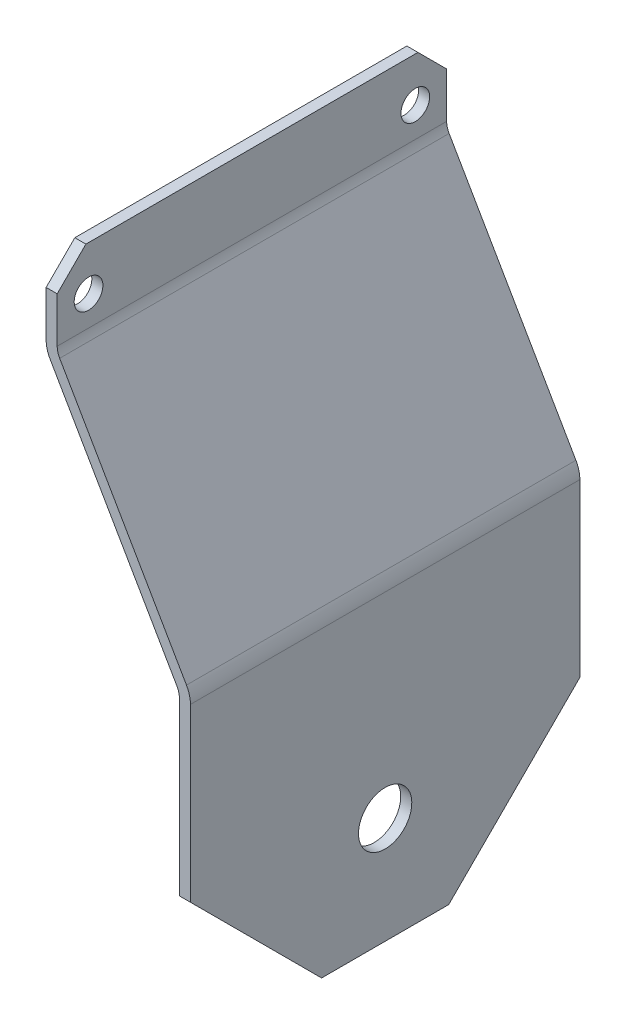
ISO-10303-21;
HEADER;
FILE_DESCRIPTION(('STEP AP214'),'2;1');
FILE_NAME('part.step','',(''),(''),'','','');
FILE_SCHEMA(('AUTOMOTIVE_DESIGN { 1 0 10303 214 1 1 1 1 }'));
ENDSEC;
DATA;
#1=APPLICATION_CONTEXT('core data for automotive mechanical design processes');
#2=APPLICATION_PROTOCOL_DEFINITION('international standard','automotive_design',2000,#1);
#3=PRODUCT_CONTEXT('',#1,'mechanical');
#4=PRODUCT('Part','Part','',(#3));
#5=PRODUCT_RELATED_PRODUCT_CATEGORY('part','',(#4));
#6=PRODUCT_DEFINITION_FORMATION('','',#4);
#7=PRODUCT_DEFINITION_CONTEXT('part definition',#1,'design');
#8=PRODUCT_DEFINITION('design','',#6,#7);
#9=PRODUCT_DEFINITION_SHAPE('','',#8);
#10=(LENGTH_UNIT() NAMED_UNIT(*) SI_UNIT(.MILLI.,.METRE.));
#11=(NAMED_UNIT(*) PLANE_ANGLE_UNIT() SI_UNIT($,.RADIAN.));
#12=(NAMED_UNIT(*) SI_UNIT($,.STERADIAN.) SOLID_ANGLE_UNIT());
#13=UNCERTAINTY_MEASURE_WITH_UNIT(LENGTH_MEASURE(1.E-05),#10,'distance_accuracy_value','');
#14=(GEOMETRIC_REPRESENTATION_CONTEXT(3) GLOBAL_UNCERTAINTY_ASSIGNED_CONTEXT((#13)) GLOBAL_UNIT_ASSIGNED_CONTEXT((#10,
#11,#12)) REPRESENTATION_CONTEXT('',''));
#15=CARTESIAN_POINT('',(0.,0.,0.));
#16=DIRECTION('',(0.,0.,1.));
#17=DIRECTION('',(1.,0.,0.));
#18=AXIS2_PLACEMENT_3D('',#15,#16,#17);
#19=CARTESIAN_POINT('',(-32.5,76.2916512459885,-47.5));
#20=DIRECTION('',(0.,1.,0.));
#21=DIRECTION('',(0.,0.,1.));
#22=AXIS2_PLACEMENT_3D('',#19,#20,#21);
#23=PLANE('',#22);
#24=DIRECTION('',(1.,0.,0.));
#25=VECTOR('',#24,1.);
#26=CARTESIAN_POINT('',(-20.9172517799081,76.2916512459885,-40.5));
#27=LINE('',#26,#25);
#28=CARTESIAN_POINT('',(-32.5,76.2916512459885,-40.5));
#29=VERTEX_POINT('',#28);
#30=CARTESIAN_POINT('',(-29.8,76.2916512459885,-40.5));
#31=VERTEX_POINT('',#30);
#32=EDGE_CURVE('E224',#29,#31,#27,.T.);
#33=ORIENTED_EDGE('',*,*,#32,.F.);
#34=DIRECTION('',(0.,0.,1.));
#35=VECTOR('',#34,1.);
#36=CARTESIAN_POINT('',(-32.5,76.2916512459885,-47.5));
#37=LINE('',#36,#35);
#38=CARTESIAN_POINT('',(-32.5,76.2916512459885,40.5));
#39=VERTEX_POINT('',#38);
#40=EDGE_CURVE('E154',#39,#29,#37,.F.);
#41=ORIENTED_EDGE('',*,*,#40,.F.);
#42=DIRECTION('',(1.,0.,0.));
#43=VECTOR('',#42,1.);
#44=CARTESIAN_POINT('',(-20.9172517799081,76.2916512459885,40.5));
#45=LINE('',#44,#43);
#46=CARTESIAN_POINT('',(-29.8,76.2916512459885,40.5));
#47=VERTEX_POINT('',#46);
#48=EDGE_CURVE('E152',#47,#39,#45,.F.);
#49=ORIENTED_EDGE('',*,*,#48,.F.);
#50=DIRECTION('',(0.,0.,-1.));
#51=VECTOR('',#50,1.);
#52=CARTESIAN_POINT('',(-29.8,76.2916512459885,-47.5));
#53=LINE('',#52,#51);
#54=EDGE_CURVE('E140',#31,#47,#53,.F.);
#55=ORIENTED_EDGE('',*,*,#54,.F.);
#56=EDGE_LOOP('',(#33,#41,#49,#55));
#57=FACE_BOUND('',#56,.T.);
#58=ADVANCED_FACE('F17',(#57),#23,.T.);
#59=CARTESIAN_POINT('',(-32.5,65.4996512459885,39.853));
#60=DIRECTION('',(1.,0.,0.));
#61=DIRECTION('',(0.,0.,-1.));
#62=AXIS2_PLACEMENT_3D('',#59,#60,#61);
#63=CYLINDRICAL_SURFACE('',#62,3.49999999999999);
#64=CARTESIAN_POINT('',(-29.8,65.4996512459885,39.853));
#65=DIRECTION('',(1.,0.,0.));
#66=DIRECTION('',(0.,0.,-1.));
#67=AXIS2_PLACEMENT_3D('',#64,#65,#66);
#68=CIRCLE('',#67,3.49999999999999);
#69=CARTESIAN_POINT('',(-29.8,65.4996512459885,36.353));
#70=VERTEX_POINT('',#69);
#71=EDGE_CURVE('E149',#70,#70,#68,.F.);
#72=ORIENTED_EDGE('',*,*,#71,.F.);
#73=EDGE_LOOP('',(#72));
#74=FACE_BOUND('',#73,.T.);
#75=CARTESIAN_POINT('',(-32.5,65.4996512459885,39.853));
#76=DIRECTION('',(1.,0.,0.));
#77=DIRECTION('',(0.,0.,-1.));
#78=AXIS2_PLACEMENT_3D('',#75,#76,#77);
#79=CIRCLE('',#78,3.49999999999999);
#80=CARTESIAN_POINT('',(-32.5,65.4996512459885,36.353));
#81=VERTEX_POINT('',#80);
#82=EDGE_CURVE('E197',#81,#81,#79,.T.);
#83=ORIENTED_EDGE('',*,*,#82,.F.);
#84=EDGE_LOOP('',(#83));
#85=FACE_BOUND('',#84,.T.);
#86=ADVANCED_FACE('F276',(#74,#85),#63,.F.);
#87=CARTESIAN_POINT('',(-32.5,65.4996512459885,-39.853));
#88=DIRECTION('',(1.,0.,0.));
#89=DIRECTION('',(0.,0.,-1.));
#90=AXIS2_PLACEMENT_3D('',#87,#88,#89);
#91=CYLINDRICAL_SURFACE('',#90,3.5);
#92=CARTESIAN_POINT('',(-29.8,65.4996512459885,-39.853));
#93=DIRECTION('',(1.,0.,0.));
#94=DIRECTION('',(0.,0.,-1.));
#95=AXIS2_PLACEMENT_3D('',#92,#93,#94);
#96=CIRCLE('',#95,3.5);
#97=CARTESIAN_POINT('',(-29.8,65.4996512459885,-43.353));
#98=VERTEX_POINT('',#97);
#99=EDGE_CURVE('E160',#98,#98,#96,.F.);
#100=ORIENTED_EDGE('',*,*,#99,.F.);
#101=EDGE_LOOP('',(#100));
#102=FACE_BOUND('',#101,.T.);
#103=CARTESIAN_POINT('',(-32.5,65.4996512459885,-39.853));
#104=DIRECTION('',(1.,0.,0.));
#105=DIRECTION('',(0.,0.,-1.));
#106=AXIS2_PLACEMENT_3D('',#103,#104,#105);
#107=CIRCLE('',#106,3.5);
#108=CARTESIAN_POINT('',(-32.5,65.4996512459885,-43.353));
#109=VERTEX_POINT('',#108);
#110=EDGE_CURVE('E268',#109,#109,#107,.T.);
#111=ORIENTED_EDGE('',*,*,#110,.F.);
#112=EDGE_LOOP('',(#111));
#113=FACE_BOUND('',#112,.T.);
#114=ADVANCED_FACE('F279',(#102,#113),#91,.F.);
#115=CARTESIAN_POINT('',(2.70000000000001,-75.,-47.5));
#116=DIRECTION('',(0.,-1.,0.));
#117=DIRECTION('',(0.,0.,-1.));
#118=AXIS2_PLACEMENT_3D('',#115,#116,#117);
#119=PLANE('',#118);
#120=DIRECTION('',(1.,0.,0.));
#121=VECTOR('',#120,1.);
#122=CARTESIAN_POINT('',(-3.31725177990806,-75.,15.5));
#123=LINE('',#122,#121);
#124=CARTESIAN_POINT('',(0.,-75.,15.5));
#125=VERTEX_POINT('',#124);
#126=CARTESIAN_POINT('',(2.7,-75.,15.5));
#127=VERTEX_POINT('',#126);
#128=EDGE_CURVE('E211',#125,#127,#123,.T.);
#129=ORIENTED_EDGE('',*,*,#128,.F.);
#130=DIRECTION('',(0.,0.,1.));
#131=VECTOR('',#130,1.);
#132=CARTESIAN_POINT('',(0.,-75.,-47.5));
#133=LINE('',#132,#131);
#134=CARTESIAN_POINT('',(0.,-75.,-15.5));
#135=VERTEX_POINT('',#134);
#136=EDGE_CURVE('E186',#135,#125,#133,.T.);
#137=ORIENTED_EDGE('',*,*,#136,.F.);
#138=DIRECTION('',(1.,0.,0.));
#139=VECTOR('',#138,1.);
#140=CARTESIAN_POINT('',(-3.31725177990806,-75.,-15.5));
#141=LINE('',#140,#139);
#142=CARTESIAN_POINT('',(2.7,-75.,-15.5));
#143=VERTEX_POINT('',#142);
#144=EDGE_CURVE('E215',#143,#135,#141,.F.);
#145=ORIENTED_EDGE('',*,*,#144,.F.);
#146=DIRECTION('',(0.,0.,-1.));
#147=VECTOR('',#146,1.);
#148=CARTESIAN_POINT('',(2.7,-75.,-47.5));
#149=LINE('',#148,#147);
#150=EDGE_CURVE('E180',#127,#143,#149,.T.);
#151=ORIENTED_EDGE('',*,*,#150,.F.);
#152=EDGE_LOOP('',(#129,#137,#145,#151));
#153=FACE_BOUND('',#152,.T.);
#154=ADVANCED_FACE('F400',(#153),#119,.T.);
#155=CARTESIAN_POINT('',(2.7,-49.,0.));
#156=DIRECTION('',(-1.,0.,0.));
#157=DIRECTION('',(0.,-1.,0.));
#158=AXIS2_PLACEMENT_3D('',#155,#156,#157);
#159=CYLINDRICAL_SURFACE('',#158,6.5);
#160=CARTESIAN_POINT('',(0.,-49.,0.));
#161=DIRECTION('',(-1.,0.,0.));
#162=DIRECTION('',(0.,-1.,0.));
#163=AXIS2_PLACEMENT_3D('',#160,#161,#162);
#164=CIRCLE('',#163,6.5);
#165=CARTESIAN_POINT('',(0.,-55.5,0.));
#166=VERTEX_POINT('',#165);
#167=EDGE_CURVE('E176',#166,#166,#164,.F.);
#168=ORIENTED_EDGE('',*,*,#167,.F.);
#169=EDGE_LOOP('',(#168));
#170=FACE_BOUND('',#169,.T.);
#171=CARTESIAN_POINT('',(2.7,-49.,0.));
#172=DIRECTION('',(-1.,0.,0.));
#173=DIRECTION('',(0.,-1.,0.));
#174=AXIS2_PLACEMENT_3D('',#171,#172,#173);
#175=CIRCLE('',#174,6.5);
#176=CARTESIAN_POINT('',(2.7,-55.5,0.));
#177=VERTEX_POINT('',#176);
#178=EDGE_CURVE('E21',#177,#177,#175,.T.);
#179=ORIENTED_EDGE('',*,*,#178,.F.);
#180=EDGE_LOOP('',(#179));
#181=FACE_BOUND('',#180,.T.);
#182=ADVANCED_FACE('F19',(#170,#181),#159,.F.);
#183=CARTESIAN_POINT('',(-20.9172517799081,72.7916512459885,-44.));
#184=DIRECTION('',(0.,0.707106781186548,-0.707106781186548));
#185=DIRECTION('',(0.,0.707106781186548,0.707106781186548));
#186=AXIS2_PLACEMENT_3D('',#183,#184,#185);
#187=PLANE('',#186);
#188=DIRECTION('',(0.,0.707106781186548,0.707106781186547));
#189=VECTOR('',#188,1.);
#190=CARTESIAN_POINT('',(-29.8,69.2916512459885,-47.5));
#191=LINE('',#190,#189);
#192=CARTESIAN_POINT('',(-29.8,69.2916512459885,-47.5));
#193=VERTEX_POINT('',#192);
#194=EDGE_CURVE('E147',#193,#31,#191,.T.);
#195=ORIENTED_EDGE('',*,*,#194,.F.);
#196=DIRECTION('',(1.,0.,0.));
#197=VECTOR('',#196,1.);
#198=CARTESIAN_POINT('',(-9.33450355981613,69.2916512459885,-47.5));
#199=LINE('',#198,#197);
#200=CARTESIAN_POINT('',(-32.5,69.2916512459885,-47.5));
#201=VERTEX_POINT('',#200);
#202=EDGE_CURVE('E200',#193,#201,#199,.F.);
#203=ORIENTED_EDGE('',*,*,#202,.T.);
#204=DIRECTION('',(0.,-0.707106781186548,-0.707106781186547));
#205=VECTOR('',#204,1.);
#206=CARTESIAN_POINT('',(-32.5,76.2916512459885,-40.5));
#207=LINE('',#206,#205);
#208=EDGE_CURVE('E194',#29,#201,#207,.T.);
#209=ORIENTED_EDGE('',*,*,#208,.F.);
#210=ORIENTED_EDGE('',*,*,#32,.T.);
#211=EDGE_LOOP('',(#195,#203,#209,#210));
#212=FACE_BOUND('',#211,.T.);
#213=ADVANCED_FACE('F416',(#212),#187,.T.);
#214=CARTESIAN_POINT('',(-3.31725177990806,-59.,-31.5));
#215=DIRECTION('',(0.,-0.707106781186548,-0.707106781186548));
#216=DIRECTION('',(0.,0.707106781186548,-0.707106781186548));
#217=AXIS2_PLACEMENT_3D('',#214,#215,#216);
#218=PLANE('',#217);
#219=DIRECTION('',(0.,-0.707106781186548,0.707106781186548));
#220=VECTOR('',#219,1.);
#221=CARTESIAN_POINT('',(0.,-43.,-47.5));
#222=LINE('',#221,#220);
#223=CARTESIAN_POINT('',(0.,-43.,-47.5));
#224=VERTEX_POINT('',#223);
#225=EDGE_CURVE('E183',#224,#135,#222,.T.);
#226=ORIENTED_EDGE('',*,*,#225,.F.);
#227=DIRECTION('',(1.,0.,0.));
#228=VECTOR('',#227,1.);
#229=CARTESIAN_POINT('',(-9.33450355981613,-43.,-47.5));
#230=LINE('',#229,#228);
#231=CARTESIAN_POINT('',(2.7,-43.,-47.5));
#232=VERTEX_POINT('',#231);
#233=EDGE_CURVE('E173',#224,#232,#230,.T.);
#234=ORIENTED_EDGE('',*,*,#233,.T.);
#235=DIRECTION('',(0.,0.707106781186548,-0.707106781186548));
#236=VECTOR('',#235,1.);
#237=CARTESIAN_POINT('',(2.7,-75.,-15.5));
#238=LINE('',#237,#236);
#239=EDGE_CURVE('E87',#143,#232,#238,.T.);
#240=ORIENTED_EDGE('',*,*,#239,.F.);
#241=ORIENTED_EDGE('',*,*,#144,.T.);
#242=EDGE_LOOP('',(#226,#234,#240,#241));
#243=FACE_BOUND('',#242,.T.);
#244=ADVANCED_FACE('F396',(#243),#218,.T.);
#245=CARTESIAN_POINT('',(-3.31725177990806,-59.,31.5));
#246=DIRECTION('',(0.,-0.707106781186548,0.707106781186548));
#247=DIRECTION('',(0.,-0.707106781186548,-0.707106781186548));
#248=AXIS2_PLACEMENT_3D('',#245,#246,#247);
#249=PLANE('',#248);
#250=DIRECTION('',(0.,-0.707106781186548,-0.707106781186548));
#251=VECTOR('',#250,1.);
#252=CARTESIAN_POINT('',(2.7,-43.,47.5));
#253=LINE('',#252,#251);
#254=CARTESIAN_POINT('',(2.7,-43.,47.5));
#255=VERTEX_POINT('',#254);
#256=EDGE_CURVE('E177',#255,#127,#253,.T.);
#257=ORIENTED_EDGE('',*,*,#256,.F.);
#258=DIRECTION('',(1.,0.,0.));
#259=VECTOR('',#258,1.);
#260=CARTESIAN_POINT('',(-9.33450355981613,-43.,47.5));
#261=LINE('',#260,#259);
#262=CARTESIAN_POINT('',(0.,-43.,47.5));
#263=VERTEX_POINT('',#262);
#264=EDGE_CURVE('E256',#263,#255,#261,.T.);
#265=ORIENTED_EDGE('',*,*,#264,.F.);
#266=DIRECTION('',(0.,0.707106781186548,0.707106781186548));
#267=VECTOR('',#266,1.);
#268=CARTESIAN_POINT('',(0.,-75.,15.5));
#269=LINE('',#268,#267);
#270=EDGE_CURVE('E220',#125,#263,#269,.T.);
#271=ORIENTED_EDGE('',*,*,#270,.F.);
#272=ORIENTED_EDGE('',*,*,#128,.T.);
#273=EDGE_LOOP('',(#257,#265,#271,#272));
#274=FACE_BOUND('',#273,.T.);
#275=ADVANCED_FACE('F422',(#274),#249,.T.);
#276=CARTESIAN_POINT('',(2.7,0.723462819564035,-47.5));
#277=DIRECTION('',(1.,0.,0.));
#278=DIRECTION('',(0.,0.,-1.));
#279=AXIS2_PLACEMENT_3D('',#276,#277,#278);
#280=PLANE('',#279);
#281=ORIENTED_EDGE('',*,*,#178,.T.);
#282=EDGE_LOOP('',(#281));
#283=FACE_BOUND('',#282,.T.);
#284=ORIENTED_EDGE('',*,*,#256,.T.);
#285=ORIENTED_EDGE('',*,*,#150,.T.);
#286=ORIENTED_EDGE('',*,*,#239,.T.);
#287=DIRECTION('',(0.,1.,0.));
#288=VECTOR('',#287,1.);
#289=CARTESIAN_POINT('',(2.7,2.13709589961981,-47.5));
#290=LINE('',#289,#288);
#291=CARTESIAN_POINT('',(2.7,-1.20577136594005,-47.5));
#292=VERTEX_POINT('',#291);
#293=EDGE_CURVE('E79',#232,#292,#290,.T.);
#294=ORIENTED_EDGE('',*,*,#293,.T.);
#295=DIRECTION('',(0.,0.,-1.));
#296=VECTOR('',#295,1.);
#297=CARTESIAN_POINT('',(2.7,-1.20577136594005,0.));
#298=LINE('',#297,#296);
#299=CARTESIAN_POINT('',(2.7,-1.20577136594005,47.5));
#300=VERTEX_POINT('',#299);
#301=EDGE_CURVE('E174',#300,#292,#298,.T.);
#302=ORIENTED_EDGE('',*,*,#301,.F.);
#303=DIRECTION('',(0.,1.,0.));
#304=VECTOR('',#303,1.);
#305=CARTESIAN_POINT('',(2.7,2.13709589961981,47.5));
#306=LINE('',#305,#304);
#307=EDGE_CURVE('E254',#255,#300,#306,.T.);
#308=ORIENTED_EDGE('',*,*,#307,.F.);
#309=EDGE_LOOP('',(#284,#285,#286,#294,#302,#308));
#310=FACE_BOUND('',#309,.T.);
#311=ADVANCED_FACE('F420',(#283,#310),#280,.T.);
#312=CARTESIAN_POINT('',(-29.8,76.2916512459885,-47.5));
#313=DIRECTION('',(1.,0.,0.));
#314=DIRECTION('',(0.,0.,-1.));
#315=AXIS2_PLACEMENT_3D('',#312,#313,#314);
#316=PLANE('',#315);
#317=ORIENTED_EDGE('',*,*,#99,.T.);
#318=EDGE_LOOP('',(#317));
#319=FACE_BOUND('',#318,.T.);
#320=ORIENTED_EDGE('',*,*,#71,.T.);
#321=EDGE_LOOP('',(#320));
#322=FACE_BOUND('',#321,.T.);
#323=ORIENTED_EDGE('',*,*,#194,.T.);
#324=ORIENTED_EDGE('',*,*,#54,.T.);
#325=DIRECTION('',(0.,-0.707106781186548,0.707106781186547));
#326=VECTOR('',#325,1.);
#327=CARTESIAN_POINT('',(-29.8,72.7916512459885,44.));
#328=LINE('',#327,#326);
#329=CARTESIAN_POINT('',(-29.8,69.2916512459885,47.5));
#330=VERTEX_POINT('',#329);
#331=EDGE_CURVE('E145',#330,#47,#328,.F.);
#332=ORIENTED_EDGE('',*,*,#331,.F.);
#333=DIRECTION('',(0.,1.,0.));
#334=VECTOR('',#333,1.);
#335=CARTESIAN_POINT('',(-29.8,2.13709589961981,47.5));
#336=LINE('',#335,#334);
#337=CARTESIAN_POINT('',(-29.8,58.2208854314926,47.5));
#338=VERTEX_POINT('',#337);
#339=EDGE_CURVE('E250',#338,#330,#336,.T.);
#340=ORIENTED_EDGE('',*,*,#339,.F.);
#341=DIRECTION('',(0.,0.,1.));
#342=VECTOR('',#341,1.);
#343=CARTESIAN_POINT('',(-29.8,58.2208854314926,0.));
#344=LINE('',#343,#342);
#345=CARTESIAN_POINT('',(-29.8,58.2208854314926,-47.5));
#346=VERTEX_POINT('',#345);
#347=EDGE_CURVE('E170',#338,#346,#344,.F.);
#348=ORIENTED_EDGE('',*,*,#347,.T.);
#349=DIRECTION('',(0.,1.,0.));
#350=VECTOR('',#349,1.);
#351=CARTESIAN_POINT('',(-29.8,2.13709589961981,-47.5));
#352=LINE('',#351,#350);
#353=EDGE_CURVE('E204',#346,#193,#352,.T.);
#354=ORIENTED_EDGE('',*,*,#353,.T.);
#355=EDGE_LOOP('',(#323,#324,#332,#340,#348,#354));
#356=FACE_BOUND('',#355,.T.);
#357=ADVANCED_FACE('F142',(#319,#322,#356),#316,.T.);
#358=CARTESIAN_POINT('',(-20.9172517799081,72.7916512459885,44.));
#359=DIRECTION('',(0.,0.707106781186547,0.707106781186548));
#360=DIRECTION('',(0.,-0.707106781186548,0.707106781186547));
#361=AXIS2_PLACEMENT_3D('',#358,#359,#360);
#362=PLANE('',#361);
#363=DIRECTION('',(0.,0.707106781186548,-0.707106781186547));
#364=VECTOR('',#363,1.);
#365=CARTESIAN_POINT('',(-32.5,69.2916512459885,47.5));
#366=LINE('',#365,#364);
#367=CARTESIAN_POINT('',(-32.5,69.2916512459885,47.5));
#368=VERTEX_POINT('',#367);
#369=EDGE_CURVE('E129',#368,#39,#366,.T.);
#370=ORIENTED_EDGE('',*,*,#369,.F.);
#371=DIRECTION('',(1.,0.,0.));
#372=VECTOR('',#371,1.);
#373=CARTESIAN_POINT('',(-9.33450355981613,69.2916512459885,47.5));
#374=LINE('',#373,#372);
#375=EDGE_CURVE('E158',#330,#368,#374,.F.);
#376=ORIENTED_EDGE('',*,*,#375,.F.);
#377=ORIENTED_EDGE('',*,*,#331,.T.);
#378=ORIENTED_EDGE('',*,*,#48,.T.);
#379=EDGE_LOOP('',(#370,#376,#377,#378));
#380=FACE_BOUND('',#379,.T.);
#381=ADVANCED_FACE('F156',(#380),#362,.T.);
#382=CARTESIAN_POINT('',(-32.5,56.2916512459885,-47.5));
#383=DIRECTION('',(-1.,0.,0.));
#384=DIRECTION('',(0.,0.,1.));
#385=AXIS2_PLACEMENT_3D('',#382,#383,#384);
#386=PLANE('',#385);
#387=ORIENTED_EDGE('',*,*,#110,.T.);
#388=EDGE_LOOP('',(#387));
#389=FACE_BOUND('',#388,.T.);
#390=ORIENTED_EDGE('',*,*,#82,.T.);
#391=EDGE_LOOP('',(#390));
#392=FACE_BOUND('',#391,.T.);
#393=DIRECTION('',(0.,0.,1.));
#394=VECTOR('',#393,1.);
#395=CARTESIAN_POINT('',(-32.5,58.2208854314926,0.));
#396=LINE('',#395,#394);
#397=CARTESIAN_POINT('',(-32.5,58.2208854314926,47.5));
#398=VERTEX_POINT('',#397);
#399=CARTESIAN_POINT('',(-32.5,58.2208854314926,-47.5));
#400=VERTEX_POINT('',#399);
#401=EDGE_CURVE('E120',#398,#400,#396,.F.);
#402=ORIENTED_EDGE('',*,*,#401,.F.);
#403=DIRECTION('',(0.,1.,0.));
#404=VECTOR('',#403,1.);
#405=CARTESIAN_POINT('',(-32.5,2.13709589961981,47.5));
#406=LINE('',#405,#404);
#407=EDGE_CURVE('E248',#368,#398,#406,.F.);
#408=ORIENTED_EDGE('',*,*,#407,.F.);
#409=ORIENTED_EDGE('',*,*,#369,.T.);
#410=ORIENTED_EDGE('',*,*,#40,.T.);
#411=ORIENTED_EDGE('',*,*,#208,.T.);
#412=DIRECTION('',(0.,1.,0.));
#413=VECTOR('',#412,1.);
#414=CARTESIAN_POINT('',(-32.5,2.13709589961981,-47.5));
#415=LINE('',#414,#413);
#416=EDGE_CURVE('E203',#201,#400,#415,.F.);
#417=ORIENTED_EDGE('',*,*,#416,.T.);
#418=EDGE_LOOP('',(#402,#408,#409,#410,#411,#417));
#419=FACE_BOUND('',#418,.T.);
#420=ADVANCED_FACE('F283',(#389,#392,#419),#386,.T.);
#421=CARTESIAN_POINT('',(-25.3,58.2208854314926,0.));
#422=DIRECTION('',(0.,0.,1.));
#423=DIRECTION('',(1.,0.,0.));
#424=AXIS2_PLACEMENT_3D('',#421,#422,#423);
#425=CYLINDRICAL_SURFACE('',#424,7.2);
#426=ORIENTED_EDGE('',*,*,#401,.T.);
#427=CARTESIAN_POINT('',(-25.3,58.2208854314926,-47.5));
#428=DIRECTION('',(0.,0.,1.));
#429=DIRECTION('',(1.,0.,0.));
#430=AXIS2_PLACEMENT_3D('',#427,#428,#429);
#431=CIRCLE('',#430,7.2);
#432=CARTESIAN_POINT('',(-31.5353829072479,54.6208854314926,-47.5));
#433=VERTEX_POINT('',#432);
#434=EDGE_CURVE('E260',#400,#433,#431,.T.);
#435=ORIENTED_EDGE('',*,*,#434,.T.);
#436=DIRECTION('',(0.,0.,1.));
#437=VECTOR('',#436,1.);
#438=CARTESIAN_POINT('',(-31.5353829072479,54.6208854314926,-47.5));
#439=LINE('',#438,#437);
#440=CARTESIAN_POINT('',(-31.5353829072479,54.6208854314926,47.5));
#441=VERTEX_POINT('',#440);
#442=EDGE_CURVE('E334',#441,#433,#439,.F.);
#443=ORIENTED_EDGE('',*,*,#442,.F.);
#444=CARTESIAN_POINT('',(-25.3,58.2208854314926,47.5));
#445=DIRECTION('',(0.,0.,1.));
#446=DIRECTION('',(1.,0.,0.));
#447=AXIS2_PLACEMENT_3D('',#444,#445,#446);
#448=CIRCLE('',#447,7.2);
#449=EDGE_CURVE('E245',#398,#441,#448,.T.);
#450=ORIENTED_EDGE('',*,*,#449,.F.);
#451=EDGE_LOOP('',(#426,#435,#443,#450));
#452=FACE_BOUND('',#451,.T.);
#453=ADVANCED_FACE('F285',(#452),#425,.T.);
#454=CARTESIAN_POINT('',(0.,0.,-47.5));
#455=DIRECTION('',(-0.866025403784439,-0.5,0.));
#456=DIRECTION('',(0.5,-0.866025403784439,0.));
#457=AXIS2_PLACEMENT_3D('',#454,#455,#456);
#458=PLANE('',#457);
#459=ORIENTED_EDGE('',*,*,#442,.T.);
#460=DIRECTION('',(0.5,-0.866025403784439,0.));
#461=VECTOR('',#460,1.);
#462=CARTESIAN_POINT('',(-31.5353829072479,54.6208854314926,-47.5));
#463=LINE('',#462,#461);
#464=CARTESIAN_POINT('',(-0.602885682970024,1.04422863405995,-47.5));
#465=VERTEX_POINT('',#464);
#466=EDGE_CURVE('E259',#433,#465,#463,.T.);
#467=ORIENTED_EDGE('',*,*,#466,.T.);
#468=DIRECTION('',(0.,0.,-1.));
#469=VECTOR('',#468,1.);
#470=CARTESIAN_POINT('',(-0.602885682970027,1.04422863405995,0.));
#471=LINE('',#470,#469);
#472=CARTESIAN_POINT('',(-0.602885682970026,1.04422863405995,47.5));
#473=VERTEX_POINT('',#472);
#474=EDGE_CURVE('E187',#465,#473,#471,.F.);
#475=ORIENTED_EDGE('',*,*,#474,.T.);
#476=DIRECTION('',(0.5,-0.866025403784439,0.));
#477=VECTOR('',#476,1.);
#478=CARTESIAN_POINT('',(-31.5353829072479,54.6208854314926,47.5));
#479=LINE('',#478,#477);
#480=EDGE_CURVE('E244',#441,#473,#479,.T.);
#481=ORIENTED_EDGE('',*,*,#480,.F.);
#482=EDGE_LOOP('',(#459,#467,#475,#481));
#483=FACE_BOUND('',#482,.T.);
#484=ADVANCED_FACE('F293',(#483),#458,.T.);
#485=CARTESIAN_POINT('',(-4.5,-1.20577136594005,0.));
#486=DIRECTION('',(0.,0.,-1.));
#487=DIRECTION('',(-1.,0.,0.));
#488=AXIS2_PLACEMENT_3D('',#485,#486,#487);
#489=CYLINDRICAL_SURFACE('',#488,4.5);
#490=CARTESIAN_POINT('',(-4.5,-1.20577136594005,47.5));
#491=DIRECTION('',(0.,0.,-1.));
#492=DIRECTION('',(-1.,0.,0.));
#493=AXIS2_PLACEMENT_3D('',#490,#491,#492);
#494=CIRCLE('',#493,4.5);
#495=CARTESIAN_POINT('',(0.,-1.20577136594005,47.5));
#496=VERTEX_POINT('',#495);
#497=EDGE_CURVE('E240',#473,#496,#494,.T.);
#498=ORIENTED_EDGE('',*,*,#497,.F.);
#499=ORIENTED_EDGE('',*,*,#474,.F.);
#500=CARTESIAN_POINT('',(-4.5,-1.20577136594005,-47.5));
#501=DIRECTION('',(0.,0.,-1.));
#502=DIRECTION('',(-1.,0.,0.));
#503=AXIS2_PLACEMENT_3D('',#500,#501,#502);
#504=CIRCLE('',#503,4.5);
#505=CARTESIAN_POINT('',(0.,-1.20577136594005,-47.5));
#506=VERTEX_POINT('',#505);
#507=EDGE_CURVE('E257',#465,#506,#504,.T.);
#508=ORIENTED_EDGE('',*,*,#507,.T.);
#509=DIRECTION('',(0.,0.,1.));
#510=VECTOR('',#509,1.);
#511=CARTESIAN_POINT('',(0.,-1.20577136594005,-47.5));
#512=LINE('',#511,#510);
#513=EDGE_CURVE('E267',#496,#506,#512,.F.);
#514=ORIENTED_EDGE('',*,*,#513,.F.);
#515=EDGE_LOOP('',(#498,#499,#508,#514));
#516=FACE_BOUND('',#515,.T.);
#517=ADVANCED_FACE('F323',(#516),#489,.F.);
#518=CARTESIAN_POINT('',(0.,-75.,-47.5));
#519=DIRECTION('',(-1.,0.,0.));
#520=DIRECTION('',(0.,0.,1.));
#521=AXIS2_PLACEMENT_3D('',#518,#519,#520);
#522=PLANE('',#521);
#523=ORIENTED_EDGE('',*,*,#167,.T.);
#524=EDGE_LOOP('',(#523));
#525=FACE_BOUND('',#524,.T.);
#526=ORIENTED_EDGE('',*,*,#513,.T.);
#527=DIRECTION('',(0.,1.,0.));
#528=VECTOR('',#527,1.);
#529=CARTESIAN_POINT('',(0.,2.13709589961981,-47.5));
#530=LINE('',#529,#528);
#531=EDGE_CURVE('E191',#506,#224,#530,.F.);
#532=ORIENTED_EDGE('',*,*,#531,.T.);
#533=ORIENTED_EDGE('',*,*,#225,.T.);
#534=ORIENTED_EDGE('',*,*,#136,.T.);
#535=ORIENTED_EDGE('',*,*,#270,.T.);
#536=DIRECTION('',(0.,1.,0.));
#537=VECTOR('',#536,1.);
#538=CARTESIAN_POINT('',(0.,2.13709589961981,47.5));
#539=LINE('',#538,#537);
#540=EDGE_CURVE('E243',#496,#263,#539,.F.);
#541=ORIENTED_EDGE('',*,*,#540,.F.);
#542=EDGE_LOOP('',(#526,#532,#533,#534,#535,#541));
#543=FACE_BOUND('',#542,.T.);
#544=ADVANCED_FACE('F319',(#525,#543),#522,.T.);
#545=CARTESIAN_POINT('',(-4.5,-1.20577136594005,0.));
#546=DIRECTION('',(0.,0.,-1.));
#547=DIRECTION('',(-1.,0.,0.));
#548=AXIS2_PLACEMENT_3D('',#545,#546,#547);
#549=CYLINDRICAL_SURFACE('',#548,7.2);
#550=DIRECTION('',(0.,0.,1.));
#551=VECTOR('',#550,1.);
#552=CARTESIAN_POINT('',(1.73538290724796,2.39422863405994,-47.5));
#553=LINE('',#552,#551);
#554=CARTESIAN_POINT('',(1.73538290724796,2.39422863405994,47.5));
#555=VERTEX_POINT('',#554);
#556=CARTESIAN_POINT('',(1.73538290724796,2.39422863405995,-47.5));
#557=VERTEX_POINT('',#556);
#558=EDGE_CURVE('E385',#555,#557,#553,.F.);
#559=ORIENTED_EDGE('',*,*,#558,.F.);
#560=CARTESIAN_POINT('',(-4.5,-1.20577136594005,47.5));
#561=DIRECTION('',(0.,0.,-1.));
#562=DIRECTION('',(-1.,0.,0.));
#563=AXIS2_PLACEMENT_3D('',#560,#561,#562);
#564=CIRCLE('',#563,7.2);
#565=EDGE_CURVE('E251',#300,#555,#564,.F.);
#566=ORIENTED_EDGE('',*,*,#565,.F.);
#567=ORIENTED_EDGE('',*,*,#301,.T.);
#568=CARTESIAN_POINT('',(-4.5,-1.20577136594005,-47.5));
#569=DIRECTION('',(0.,0.,-1.));
#570=DIRECTION('',(-1.,0.,0.));
#571=AXIS2_PLACEMENT_3D('',#568,#569,#570);
#572=CIRCLE('',#571,7.2);
#573=EDGE_CURVE('E262',#292,#557,#572,.F.);
#574=ORIENTED_EDGE('',*,*,#573,.T.);
#575=EDGE_LOOP('',(#559,#566,#567,#574));
#576=FACE_BOUND('',#575,.T.);
#577=ADVANCED_FACE('F315',(#576),#549,.T.);
#578=CARTESIAN_POINT('',(-9.33450355981613,2.13709589961981,-47.5));
#579=DIRECTION('',(0.,0.,1.));
#580=DIRECTION('',(1.,0.,0.));
#581=AXIS2_PLACEMENT_3D('',#578,#579,#580);
#582=PLANE('',#581);
#583=ORIENTED_EDGE('',*,*,#531,.F.);
#584=ORIENTED_EDGE('',*,*,#507,.F.);
#585=ORIENTED_EDGE('',*,*,#466,.F.);
#586=ORIENTED_EDGE('',*,*,#434,.F.);
#587=ORIENTED_EDGE('',*,*,#416,.F.);
#588=ORIENTED_EDGE('',*,*,#202,.F.);
#589=ORIENTED_EDGE('',*,*,#353,.F.);
#590=CARTESIAN_POINT('',(-25.3,58.2208854314926,-47.5));
#591=DIRECTION('',(0.,0.,1.));
#592=DIRECTION('',(1.,0.,0.));
#593=AXIS2_PLACEMENT_3D('',#590,#591,#592);
#594=CIRCLE('',#593,4.5);
#595=CARTESIAN_POINT('',(-29.19711431703,55.9708854314926,-47.5));
#596=VERTEX_POINT('',#595);
#597=EDGE_CURVE('E172',#346,#596,#594,.T.);
#598=ORIENTED_EDGE('',*,*,#597,.T.);
#599=DIRECTION('',(-0.5,0.866025403784439,0.));
#600=VECTOR('',#599,1.);
#601=CARTESIAN_POINT('',(-29.8,57.0151140655525,-47.5));
#602=LINE('',#601,#600);
#603=EDGE_CURVE('E383',#557,#596,#602,.T.);
#604=ORIENTED_EDGE('',*,*,#603,.F.);
#605=ORIENTED_EDGE('',*,*,#573,.F.);
#606=ORIENTED_EDGE('',*,*,#293,.F.);
#607=ORIENTED_EDGE('',*,*,#233,.F.);
#608=EDGE_LOOP('',(#583,#584,#585,#586,#587,#588,#589,#598,#604,#605,#606,#607));
#609=FACE_BOUND('',#608,.T.);
#610=ADVANCED_FACE('F312',(#609),#582,.F.);
#611=CARTESIAN_POINT('',(-25.3,58.2208854314926,0.));
#612=DIRECTION('',(0.,0.,1.));
#613=DIRECTION('',(1.,0.,0.));
#614=AXIS2_PLACEMENT_3D('',#611,#612,#613);
#615=CYLINDRICAL_SURFACE('',#614,4.5);
#616=ORIENTED_EDGE('',*,*,#597,.F.);
#617=ORIENTED_EDGE('',*,*,#347,.F.);
#618=CARTESIAN_POINT('',(-25.3,58.2208854314926,47.5));
#619=DIRECTION('',(0.,0.,1.));
#620=DIRECTION('',(1.,0.,0.));
#621=AXIS2_PLACEMENT_3D('',#618,#619,#620);
#622=CIRCLE('',#621,4.5);
#623=CARTESIAN_POINT('',(-29.19711431703,55.9708854314926,47.5));
#624=VERTEX_POINT('',#623);
#625=EDGE_CURVE('E36',#624,#338,#622,.F.);
#626=ORIENTED_EDGE('',*,*,#625,.F.);
#627=DIRECTION('',(0.,0.,1.));
#628=VECTOR('',#627,1.);
#629=CARTESIAN_POINT('',(-29.19711431703,55.9708854314926,-47.5));
#630=LINE('',#629,#628);
#631=EDGE_CURVE('E27',#596,#624,#630,.T.);
#632=ORIENTED_EDGE('',*,*,#631,.F.);
#633=EDGE_LOOP('',(#616,#617,#626,#632));
#634=FACE_BOUND('',#633,.T.);
#635=ADVANCED_FACE('F305',(#634),#615,.F.);
#636=CARTESIAN_POINT('',(-9.33450355981613,2.13709589961981,47.5));
#637=DIRECTION('',(0.,0.,1.));
#638=DIRECTION('',(1.,0.,0.));
#639=AXIS2_PLACEMENT_3D('',#636,#637,#638);
#640=PLANE('',#639);
#641=ORIENTED_EDGE('',*,*,#497,.T.);
#642=ORIENTED_EDGE('',*,*,#540,.T.);
#643=ORIENTED_EDGE('',*,*,#264,.T.);
#644=ORIENTED_EDGE('',*,*,#307,.T.);
#645=ORIENTED_EDGE('',*,*,#565,.T.);
#646=DIRECTION('',(-0.5,0.866025403784439,0.));
#647=VECTOR('',#646,1.);
#648=CARTESIAN_POINT('',(-29.8,57.0151140655525,47.5000000000001));
#649=LINE('',#648,#647);
#650=EDGE_CURVE('E11',#624,#555,#649,.F.);
#651=ORIENTED_EDGE('',*,*,#650,.F.);
#652=ORIENTED_EDGE('',*,*,#625,.T.);
#653=ORIENTED_EDGE('',*,*,#339,.T.);
#654=ORIENTED_EDGE('',*,*,#375,.T.);
#655=ORIENTED_EDGE('',*,*,#407,.T.);
#656=ORIENTED_EDGE('',*,*,#449,.T.);
#657=ORIENTED_EDGE('',*,*,#480,.T.);
#658=EDGE_LOOP('',(#641,#642,#643,#644,#645,#651,#652,#653,#654,#655,#656,#657));
#659=FACE_BOUND('',#658,.T.);
#660=ADVANCED_FACE('F299',(#659),#640,.T.);
#661=CARTESIAN_POINT('',(-29.8,57.0151140655525,-47.5));
#662=DIRECTION('',(0.866025403784439,0.5,0.));
#663=DIRECTION('',(-0.5,0.866025403784439,0.));
#664=AXIS2_PLACEMENT_3D('',#661,#662,#663);
#665=PLANE('',#664);
#666=ORIENTED_EDGE('',*,*,#631,.T.);
#667=ORIENTED_EDGE('',*,*,#650,.T.);
#668=ORIENTED_EDGE('',*,*,#558,.T.);
#669=ORIENTED_EDGE('',*,*,#603,.T.);
#670=EDGE_LOOP('',(#666,#667,#668,#669));
#671=FACE_BOUND('',#670,.T.);
#672=ADVANCED_FACE('F297',(#671),#665,.T.);
#673=CLOSED_SHELL('',(#58,#86,#114,#154,#182,#213,#244,#275,#311,#357,#381,#420,#453,#484,#517,
#544,#577,#610,#635,#660,#672));
#674=MANIFOLD_SOLID_BREP('B1',#673);
#675=ADVANCED_BREP_SHAPE_REPRESENTATION('',(#18,#674),#14);
#676=SHAPE_DEFINITION_REPRESENTATION(#9,#675);
ENDSEC;
END-ISO-10303-21;
